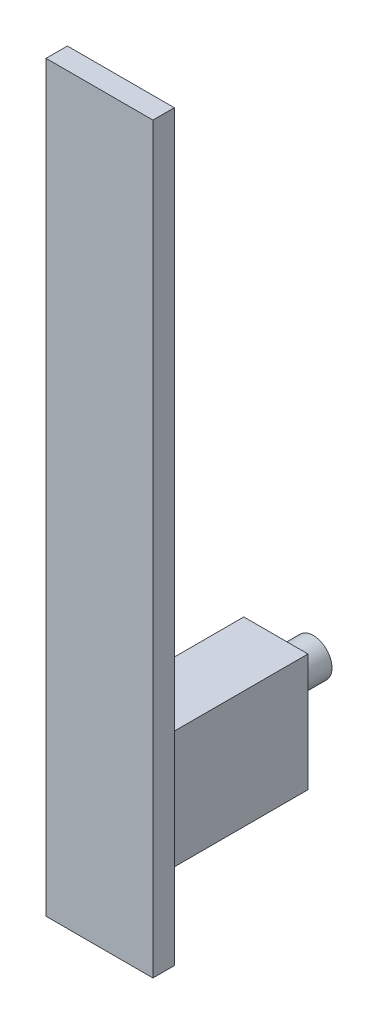
ISO-10303-21;
HEADER;
FILE_DESCRIPTION(('STEP AP214'),'2;1');
FILE_NAME('part.step','',(''),(''),'','','');
FILE_SCHEMA(('AUTOMOTIVE_DESIGN { 1 0 10303 214 1 1 1 1 }'));
ENDSEC;
DATA;
#1=APPLICATION_CONTEXT('core data for automotive mechanical design processes');
#2=APPLICATION_PROTOCOL_DEFINITION('international standard','automotive_design',2000,#1);
#3=PRODUCT_CONTEXT('',#1,'mechanical');
#4=PRODUCT('Part','Part','',(#3));
#5=PRODUCT_RELATED_PRODUCT_CATEGORY('part','',(#4));
#6=PRODUCT_DEFINITION_FORMATION('','',#4);
#7=PRODUCT_DEFINITION_CONTEXT('part definition',#1,'design');
#8=PRODUCT_DEFINITION('design','',#6,#7);
#9=PRODUCT_DEFINITION_SHAPE('','',#8);
#10=(LENGTH_UNIT() NAMED_UNIT(*) SI_UNIT(.MILLI.,.METRE.));
#11=(NAMED_UNIT(*) PLANE_ANGLE_UNIT() SI_UNIT($,.RADIAN.));
#12=(NAMED_UNIT(*) SI_UNIT($,.STERADIAN.) SOLID_ANGLE_UNIT());
#13=UNCERTAINTY_MEASURE_WITH_UNIT(LENGTH_MEASURE(1.E-05),#10,'distance_accuracy_value','');
#14=(GEOMETRIC_REPRESENTATION_CONTEXT(3) GLOBAL_UNCERTAINTY_ASSIGNED_CONTEXT((#13)) GLOBAL_UNIT_ASSIGNED_CONTEXT((#10,
#11,#12)) REPRESENTATION_CONTEXT('',''));
#15=CARTESIAN_POINT('',(0.,0.,0.));
#16=DIRECTION('',(0.,0.,1.));
#17=DIRECTION('',(1.,0.,0.));
#18=AXIS2_PLACEMENT_3D('',#15,#16,#17);
#19=CARTESIAN_POINT('',(0.,0.,4.));
#20=DIRECTION('',(1.,0.,0.));
#21=DIRECTION('',(0.,0.,-1.));
#22=AXIS2_PLACEMENT_3D('',#19,#20,#21);
#23=PLANE('',#22);
#24=DIRECTION('',(0.,-1.,0.));
#25=VECTOR('',#24,1.);
#26=CARTESIAN_POINT('',(0.,0.,0.));
#27=LINE('',#26,#25);
#28=CARTESIAN_POINT('',(0.,139.,0.));
#29=VERTEX_POINT('',#28);
#30=CARTESIAN_POINT('',(0.,0.,0.));
#31=VERTEX_POINT('',#30);
#32=EDGE_CURVE('E185',#29,#31,#27,.T.);
#33=ORIENTED_EDGE('',*,*,#32,.T.);
#34=DIRECTION('',(0.,0.,-1.));
#35=VECTOR('',#34,1.);
#36=CARTESIAN_POINT('',(0.,0.,4.));
#37=LINE('',#36,#35);
#38=CARTESIAN_POINT('',(0.,0.,4.));
#39=VERTEX_POINT('',#38);
#40=EDGE_CURVE('E40',#39,#31,#37,.T.);
#41=ORIENTED_EDGE('',*,*,#40,.F.);
#42=DIRECTION('',(0.,-1.,0.));
#43=VECTOR('',#42,1.);
#44=CARTESIAN_POINT('',(0.,0.,4.));
#45=LINE('',#44,#43);
#46=CARTESIAN_POINT('',(0.,139.,4.));
#47=VERTEX_POINT('',#46);
#48=EDGE_CURVE('E188',#47,#39,#45,.T.);
#49=ORIENTED_EDGE('',*,*,#48,.F.);
#50=DIRECTION('',(0.,0.,-1.));
#51=VECTOR('',#50,1.);
#52=CARTESIAN_POINT('',(0.,139.,4.));
#53=LINE('',#52,#51);
#54=EDGE_CURVE('E198',#47,#29,#53,.T.);
#55=ORIENTED_EDGE('',*,*,#54,.T.);
#56=EDGE_LOOP('',(#33,#41,#49,#55));
#57=FACE_BOUND('',#56,.T.);
#58=ADVANCED_FACE('F37',(#57),#23,.F.);
#59=CARTESIAN_POINT('',(0.,0.,4.));
#60=DIRECTION('',(0.,1.,0.));
#61=DIRECTION('',(0.,0.,1.));
#62=AXIS2_PLACEMENT_3D('',#59,#60,#61);
#63=PLANE('',#62);
#64=DIRECTION('',(1.,0.,0.));
#65=VECTOR('',#64,1.);
#66=CARTESIAN_POINT('',(0.,0.,0.));
#67=LINE('',#66,#65);
#68=CARTESIAN_POINT('',(2.,0.,0.));
#69=VERTEX_POINT('',#68);
#70=EDGE_CURVE('E202',#31,#69,#67,.T.);
#71=ORIENTED_EDGE('',*,*,#70,.T.);
#72=DIRECTION('',(0.,0.,1.));
#73=VECTOR('',#72,1.);
#74=CARTESIAN_POINT('',(1.99999999999999,0.,-2.));
#75=LINE('',#74,#73);
#76=CARTESIAN_POINT('',(1.99999999999999,0.,-2.));
#77=VERTEX_POINT('',#76);
#78=EDGE_CURVE('E175',#77,#69,#75,.T.);
#79=ORIENTED_EDGE('',*,*,#78,.F.);
#80=DIRECTION('',(-1.,0.,0.));
#81=VECTOR('',#80,1.);
#82=CARTESIAN_POINT('',(18.,0.,-2.));
#83=LINE('',#82,#81);
#84=CARTESIAN_POINT('',(18.,0.,-2.));
#85=VERTEX_POINT('',#84);
#86=EDGE_CURVE('E158',#85,#77,#83,.T.);
#87=ORIENTED_EDGE('',*,*,#86,.F.);
#88=DIRECTION('',(0.,0.,1.));
#89=VECTOR('',#88,1.);
#90=CARTESIAN_POINT('',(18.,0.,-2.));
#91=LINE('',#90,#89);
#92=CARTESIAN_POINT('',(18.,0.,0.));
#93=VERTEX_POINT('',#92);
#94=EDGE_CURVE('E178',#85,#93,#91,.T.);
#95=ORIENTED_EDGE('',*,*,#94,.T.);
#96=CARTESIAN_POINT('',(20.,0.,0.));
#97=VERTEX_POINT('',#96);
#98=EDGE_CURVE('E201',#93,#97,#67,.T.);
#99=ORIENTED_EDGE('',*,*,#98,.T.);
#100=DIRECTION('',(0.,0.,-1.));
#101=VECTOR('',#100,1.);
#102=CARTESIAN_POINT('',(20.,0.,4.));
#103=LINE('',#102,#101);
#104=CARTESIAN_POINT('',(20.,0.,4.));
#105=VERTEX_POINT('',#104);
#106=EDGE_CURVE('E212',#105,#97,#103,.T.);
#107=ORIENTED_EDGE('',*,*,#106,.F.);
#108=DIRECTION('',(1.,0.,0.));
#109=VECTOR('',#108,1.);
#110=CARTESIAN_POINT('',(0.,0.,4.));
#111=LINE('',#110,#109);
#112=EDGE_CURVE('E191',#39,#105,#111,.T.);
#113=ORIENTED_EDGE('',*,*,#112,.F.);
#114=ORIENTED_EDGE('',*,*,#40,.T.);
#115=EDGE_LOOP('',(#71,#79,#87,#95,#99,#107,#113,#114));
#116=FACE_BOUND('',#115,.T.);
#117=ADVANCED_FACE('F221',(#116),#63,.F.);
#118=CARTESIAN_POINT('',(20.,0.,4.));
#119=DIRECTION('',(-1.,0.,0.));
#120=DIRECTION('',(0.,0.,1.));
#121=AXIS2_PLACEMENT_3D('',#118,#119,#120);
#122=PLANE('',#121);
#123=DIRECTION('',(0.,1.,0.));
#124=VECTOR('',#123,1.);
#125=CARTESIAN_POINT('',(20.,0.,0.));
#126=LINE('',#125,#124);
#127=CARTESIAN_POINT('',(20.,139.,0.));
#128=VERTEX_POINT('',#127);
#129=EDGE_CURVE('E205',#97,#128,#126,.T.);
#130=ORIENTED_EDGE('',*,*,#129,.T.);
#131=DIRECTION('',(0.,0.,-1.));
#132=VECTOR('',#131,1.);
#133=CARTESIAN_POINT('',(20.,139.,4.));
#134=LINE('',#133,#132);
#135=CARTESIAN_POINT('',(20.,139.,4.));
#136=VERTEX_POINT('',#135);
#137=EDGE_CURVE('E210',#136,#128,#134,.T.);
#138=ORIENTED_EDGE('',*,*,#137,.F.);
#139=DIRECTION('',(0.,1.,0.));
#140=VECTOR('',#139,1.);
#141=CARTESIAN_POINT('',(20.,0.,4.));
#142=LINE('',#141,#140);
#143=EDGE_CURVE('E194',#105,#136,#142,.T.);
#144=ORIENTED_EDGE('',*,*,#143,.F.);
#145=ORIENTED_EDGE('',*,*,#106,.T.);
#146=EDGE_LOOP('',(#130,#138,#144,#145));
#147=FACE_BOUND('',#146,.T.);
#148=ADVANCED_FACE('F246',(#147),#122,.F.);
#149=CARTESIAN_POINT('',(0.,139.,4.));
#150=DIRECTION('',(0.,-1.,0.));
#151=DIRECTION('',(0.,0.,-1.));
#152=AXIS2_PLACEMENT_3D('',#149,#150,#151);
#153=PLANE('',#152);
#154=DIRECTION('',(-1.,0.,0.));
#155=VECTOR('',#154,1.);
#156=CARTESIAN_POINT('',(0.,139.,0.));
#157=LINE('',#156,#155);
#158=EDGE_CURVE('E192',#128,#29,#157,.T.);
#159=ORIENTED_EDGE('',*,*,#158,.T.);
#160=ORIENTED_EDGE('',*,*,#54,.F.);
#161=DIRECTION('',(-1.,0.,0.));
#162=VECTOR('',#161,1.);
#163=CARTESIAN_POINT('',(0.,139.,4.));
#164=LINE('',#163,#162);
#165=EDGE_CURVE('E196',#136,#47,#164,.T.);
#166=ORIENTED_EDGE('',*,*,#165,.F.);
#167=ORIENTED_EDGE('',*,*,#137,.T.);
#168=EDGE_LOOP('',(#159,#160,#166,#167));
#169=FACE_BOUND('',#168,.T.);
#170=ADVANCED_FACE('F249',(#169),#153,.F.);
#171=CARTESIAN_POINT('',(0.,0.,4.));
#172=DIRECTION('',(0.,0.,-1.));
#173=DIRECTION('',(-1.,0.,0.));
#174=AXIS2_PLACEMENT_3D('',#171,#172,#173);
#175=PLANE('',#174);
#176=ORIENTED_EDGE('',*,*,#48,.T.);
#177=ORIENTED_EDGE('',*,*,#112,.T.);
#178=ORIENTED_EDGE('',*,*,#143,.T.);
#179=ORIENTED_EDGE('',*,*,#165,.T.);
#180=EDGE_LOOP('',(#176,#177,#178,#179));
#181=FACE_BOUND('',#180,.T.);
#182=ADVANCED_FACE('F251',(#181),#175,.F.);
#183=CARTESIAN_POINT('',(0.,0.,0.));
#184=DIRECTION('',(0.,0.,-1.));
#185=DIRECTION('',(-1.,0.,0.));
#186=AXIS2_PLACEMENT_3D('',#183,#184,#185);
#187=PLANE('',#186);
#188=DIRECTION('',(0.,-1.,0.));
#189=VECTOR('',#188,1.);
#190=CARTESIAN_POINT('',(18.,45.,0.));
#191=LINE('',#190,#189);
#192=CARTESIAN_POINT('',(18.,45.,0.));
#193=VERTEX_POINT('',#192);
#194=EDGE_CURVE('E146',#193,#93,#191,.T.);
#195=ORIENTED_EDGE('',*,*,#194,.F.);
#196=DIRECTION('',(1.,0.,0.));
#197=VECTOR('',#196,1.);
#198=CARTESIAN_POINT('',(18.,45.,0.));
#199=LINE('',#198,#197);
#200=CARTESIAN_POINT('',(2.00000000000001,45.,0.));
#201=VERTEX_POINT('',#200);
#202=EDGE_CURVE('E159',#201,#193,#199,.T.);
#203=ORIENTED_EDGE('',*,*,#202,.F.);
#204=DIRECTION('',(0.,1.,0.));
#205=VECTOR('',#204,1.);
#206=CARTESIAN_POINT('',(2.00000000000001,45.,0.));
#207=LINE('',#206,#205);
#208=EDGE_CURVE('E149',#69,#201,#207,.T.);
#209=ORIENTED_EDGE('',*,*,#208,.F.);
#210=ORIENTED_EDGE('',*,*,#70,.F.);
#211=ORIENTED_EDGE('',*,*,#32,.F.);
#212=ORIENTED_EDGE('',*,*,#158,.F.);
#213=ORIENTED_EDGE('',*,*,#129,.F.);
#214=ORIENTED_EDGE('',*,*,#98,.F.);
#215=EDGE_LOOP('',(#195,#203,#209,#210,#211,#212,#213,#214));
#216=FACE_BOUND('',#215,.T.);
#217=CARTESIAN_POINT('',(10.,117.,0.));
#218=DIRECTION('',(0.,0.,-1.));
#219=DIRECTION('',(-1.,0.,0.));
#220=AXIS2_PLACEMENT_3D('',#217,#218,#219);
#221=CIRCLE('',#220,3.5);
#222=CARTESIAN_POINT('',(6.50000000000001,117.,0.));
#223=VERTEX_POINT('',#222);
#224=EDGE_CURVE('E181',#223,#223,#221,.T.);
#225=ORIENTED_EDGE('',*,*,#224,.F.);
#226=EDGE_LOOP('',(#225));
#227=FACE_BOUND('',#226,.T.);
#228=ADVANCED_FACE('F229',(#216,#227),#187,.T.);
#229=CARTESIAN_POINT('',(10.,117.,3.));
#230=DIRECTION('',(0.,0.,-1.));
#231=DIRECTION('',(-1.,0.,0.));
#232=AXIS2_PLACEMENT_3D('',#229,#230,#231);
#233=CYLINDRICAL_SURFACE('',#232,3.5);
#234=CARTESIAN_POINT('',(10.,117.,3.));
#235=DIRECTION('',(0.,0.,-1.));
#236=DIRECTION('',(-1.,0.,0.));
#237=AXIS2_PLACEMENT_3D('',#234,#235,#236);
#238=CIRCLE('',#237,3.5);
#239=CARTESIAN_POINT('',(6.50000000000001,117.,3.));
#240=VERTEX_POINT('',#239);
#241=EDGE_CURVE('E182',#240,#240,#238,.T.);
#242=ORIENTED_EDGE('',*,*,#241,.F.);
#243=EDGE_LOOP('',(#242));
#244=FACE_BOUND('',#243,.T.);
#245=ORIENTED_EDGE('',*,*,#224,.T.);
#246=EDGE_LOOP('',(#245));
#247=FACE_BOUND('',#246,.T.);
#248=ADVANCED_FACE('F258',(#244,#247),#233,.F.);
#249=CARTESIAN_POINT('',(10.,117.,3.));
#250=DIRECTION('',(0.,0.,-1.));
#251=DIRECTION('',(-1.,0.,0.));
#252=AXIS2_PLACEMENT_3D('',#249,#250,#251);
#253=PLANE('',#252);
#254=ORIENTED_EDGE('',*,*,#241,.T.);
#255=EDGE_LOOP('',(#254));
#256=FACE_BOUND('',#255,.T.);
#257=ADVANCED_FACE('F290',(#256),#253,.T.);
#258=CARTESIAN_POINT('',(18.,45.,-2.));
#259=DIRECTION('',(-1.,0.,0.));
#260=DIRECTION('',(0.,-1.,0.));
#261=AXIS2_PLACEMENT_3D('',#258,#259,#260);
#262=PLANE('',#261);
#263=ORIENTED_EDGE('',*,*,#194,.T.);
#264=ORIENTED_EDGE('',*,*,#94,.F.);
#265=DIRECTION('',(0.,-1.,0.));
#266=VECTOR('',#265,1.);
#267=CARTESIAN_POINT('',(18.,45.,-2.));
#268=LINE('',#267,#266);
#269=CARTESIAN_POINT('',(18.,45.,-2.));
#270=VERTEX_POINT('',#269);
#271=EDGE_CURVE('E155',#270,#85,#268,.T.);
#272=ORIENTED_EDGE('',*,*,#271,.F.);
#273=DIRECTION('',(0.,0.,1.));
#274=VECTOR('',#273,1.);
#275=CARTESIAN_POINT('',(18.,45.,-2.));
#276=LINE('',#275,#274);
#277=EDGE_CURVE('E164',#270,#193,#276,.T.);
#278=ORIENTED_EDGE('',*,*,#277,.T.);
#279=EDGE_LOOP('',(#263,#264,#272,#278));
#280=FACE_BOUND('',#279,.T.);
#281=ADVANCED_FACE('F244',(#280),#262,.F.);
#282=CARTESIAN_POINT('',(2.00000000000001,45.,-2.));
#283=DIRECTION('',(1.,0.,0.));
#284=DIRECTION('',(0.,1.,0.));
#285=AXIS2_PLACEMENT_3D('',#282,#283,#284);
#286=PLANE('',#285);
#287=ORIENTED_EDGE('',*,*,#208,.T.);
#288=DIRECTION('',(0.,0.,1.));
#289=VECTOR('',#288,1.);
#290=CARTESIAN_POINT('',(2.00000000000001,45.,-2.));
#291=LINE('',#290,#289);
#292=CARTESIAN_POINT('',(2.00000000000001,45.,-2.));
#293=VERTEX_POINT('',#292);
#294=EDGE_CURVE('E172',#293,#201,#291,.T.);
#295=ORIENTED_EDGE('',*,*,#294,.F.);
#296=DIRECTION('',(0.,1.,0.));
#297=VECTOR('',#296,1.);
#298=CARTESIAN_POINT('',(2.00000000000001,45.,-2.));
#299=LINE('',#298,#297);
#300=EDGE_CURVE('E161',#77,#293,#299,.T.);
#301=ORIENTED_EDGE('',*,*,#300,.F.);
#302=ORIENTED_EDGE('',*,*,#78,.T.);
#303=EDGE_LOOP('',(#287,#295,#301,#302));
#304=FACE_BOUND('',#303,.T.);
#305=ADVANCED_FACE('F233',(#304),#286,.F.);
#306=CARTESIAN_POINT('',(18.,45.,-2.));
#307=DIRECTION('',(0.,-1.,0.));
#308=DIRECTION('',(0.,0.,-1.));
#309=AXIS2_PLACEMENT_3D('',#306,#307,#308);
#310=PLANE('',#309);
#311=ORIENTED_EDGE('',*,*,#202,.T.);
#312=ORIENTED_EDGE('',*,*,#277,.F.);
#313=DIRECTION('',(1.,0.,0.));
#314=VECTOR('',#313,1.);
#315=CARTESIAN_POINT('',(18.,45.,-2.));
#316=LINE('',#315,#314);
#317=EDGE_CURVE('E163',#293,#270,#316,.T.);
#318=ORIENTED_EDGE('',*,*,#317,.F.);
#319=ORIENTED_EDGE('',*,*,#294,.T.);
#320=EDGE_LOOP('',(#311,#312,#318,#319));
#321=FACE_BOUND('',#320,.T.);
#322=ADVANCED_FACE('F237',(#321),#310,.F.);
#323=CARTESIAN_POINT('',(0.,0.,-2.));
#324=DIRECTION('',(0.,0.,-1.));
#325=DIRECTION('',(-1.,0.,0.));
#326=AXIS2_PLACEMENT_3D('',#323,#324,#325);
#327=PLANE('',#326);
#328=DIRECTION('',(0.,-1.,0.));
#329=VECTOR('',#328,1.);
#330=CARTESIAN_POINT('',(16.,34.,-2.));
#331=LINE('',#330,#329);
#332=CARTESIAN_POINT('',(16.,34.,-2.));
#333=VERTEX_POINT('',#332);
#334=CARTESIAN_POINT('',(16.,12.,-2.));
#335=VERTEX_POINT('',#334);
#336=EDGE_CURVE('E52',#333,#335,#331,.T.);
#337=ORIENTED_EDGE('',*,*,#336,.F.);
#338=DIRECTION('',(1.,0.,0.));
#339=VECTOR('',#338,1.);
#340=CARTESIAN_POINT('',(16.,34.,-2.));
#341=LINE('',#340,#339);
#342=CARTESIAN_POINT('',(4.00000000000001,34.,-2.));
#343=VERTEX_POINT('',#342);
#344=EDGE_CURVE('E56',#343,#333,#341,.T.);
#345=ORIENTED_EDGE('',*,*,#344,.F.);
#346=DIRECTION('',(0.,1.,0.));
#347=VECTOR('',#346,1.);
#348=CARTESIAN_POINT('',(4.00000000000001,34.,-2.));
#349=LINE('',#348,#347);
#350=CARTESIAN_POINT('',(4.,12.,-2.));
#351=VERTEX_POINT('',#350);
#352=EDGE_CURVE('E421',#351,#343,#349,.T.);
#353=ORIENTED_EDGE('',*,*,#352,.F.);
#354=DIRECTION('',(-1.,0.,0.));
#355=VECTOR('',#354,1.);
#356=CARTESIAN_POINT('',(16.,12.,-2.));
#357=LINE('',#356,#355);
#358=EDGE_CURVE('E414',#335,#351,#357,.T.);
#359=ORIENTED_EDGE('',*,*,#358,.F.);
#360=EDGE_LOOP('',(#337,#345,#353,#359));
#361=FACE_BOUND('',#360,.T.);
#362=ORIENTED_EDGE('',*,*,#271,.T.);
#363=ORIENTED_EDGE('',*,*,#86,.T.);
#364=ORIENTED_EDGE('',*,*,#300,.T.);
#365=ORIENTED_EDGE('',*,*,#317,.T.);
#366=EDGE_LOOP('',(#362,#363,#364,#365));
#367=FACE_BOUND('',#366,.T.);
#368=ADVANCED_FACE('F241',(#361,#367),#327,.T.);
#369=CARTESIAN_POINT('',(16.,34.,-29.));
#370=DIRECTION('',(-1.,0.,0.));
#371=DIRECTION('',(0.,-1.,0.));
#372=AXIS2_PLACEMENT_3D('',#369,#370,#371);
#373=PLANE('',#372);
#374=ORIENTED_EDGE('',*,*,#336,.T.);
#375=DIRECTION('',(0.,0.,1.));
#376=VECTOR('',#375,1.);
#377=CARTESIAN_POINT('',(16.,12.,-29.));
#378=LINE('',#377,#376);
#379=CARTESIAN_POINT('',(16.,12.,-29.));
#380=VERTEX_POINT('',#379);
#381=EDGE_CURVE('E129',#380,#335,#378,.T.);
#382=ORIENTED_EDGE('',*,*,#381,.F.);
#383=DIRECTION('',(0.,-1.,0.));
#384=VECTOR('',#383,1.);
#385=CARTESIAN_POINT('',(16.,34.,-29.));
#386=LINE('',#385,#384);
#387=CARTESIAN_POINT('',(16.,34.,-29.));
#388=VERTEX_POINT('',#387);
#389=EDGE_CURVE('E135',#388,#380,#386,.T.);
#390=ORIENTED_EDGE('',*,*,#389,.F.);
#391=DIRECTION('',(0.,0.,1.));
#392=VECTOR('',#391,1.);
#393=CARTESIAN_POINT('',(16.,34.,-29.));
#394=LINE('',#393,#392);
#395=EDGE_CURVE('E418',#388,#333,#394,.T.);
#396=ORIENTED_EDGE('',*,*,#395,.T.);
#397=EDGE_LOOP('',(#374,#382,#390,#396));
#398=FACE_BOUND('',#397,.T.);
#399=ADVANCED_FACE('F145',(#398),#373,.F.);
#400=CARTESIAN_POINT('',(16.,12.,-29.));
#401=DIRECTION('',(0.,1.,0.));
#402=DIRECTION('',(0.,0.,1.));
#403=AXIS2_PLACEMENT_3D('',#400,#401,#402);
#404=PLANE('',#403);
#405=ORIENTED_EDGE('',*,*,#358,.T.);
#406=DIRECTION('',(0.,0.,1.));
#407=VECTOR('',#406,1.);
#408=CARTESIAN_POINT('',(4.,12.,-29.));
#409=LINE('',#408,#407);
#410=CARTESIAN_POINT('',(4.,12.,-29.));
#411=VERTEX_POINT('',#410);
#412=EDGE_CURVE('E131',#411,#351,#409,.T.);
#413=ORIENTED_EDGE('',*,*,#412,.F.);
#414=DIRECTION('',(-1.,0.,0.));
#415=VECTOR('',#414,1.);
#416=CARTESIAN_POINT('',(16.,12.,-29.));
#417=LINE('',#416,#415);
#418=EDGE_CURVE('E124',#380,#411,#417,.T.);
#419=ORIENTED_EDGE('',*,*,#418,.F.);
#420=ORIENTED_EDGE('',*,*,#381,.T.);
#421=EDGE_LOOP('',(#405,#413,#419,#420));
#422=FACE_BOUND('',#421,.T.);
#423=ADVANCED_FACE('F127',(#422),#404,.F.);
#424=CARTESIAN_POINT('',(4.00000000000001,34.,-29.));
#425=DIRECTION('',(1.,0.,0.));
#426=DIRECTION('',(0.,1.,0.));
#427=AXIS2_PLACEMENT_3D('',#424,#425,#426);
#428=PLANE('',#427);
#429=ORIENTED_EDGE('',*,*,#352,.T.);
#430=DIRECTION('',(0.,0.,1.));
#431=VECTOR('',#430,1.);
#432=CARTESIAN_POINT('',(4.00000000000001,34.,-29.));
#433=LINE('',#432,#431);
#434=CARTESIAN_POINT('',(4.00000000000001,34.,-29.));
#435=VERTEX_POINT('',#434);
#436=EDGE_CURVE('E151',#435,#343,#433,.T.);
#437=ORIENTED_EDGE('',*,*,#436,.F.);
#438=DIRECTION('',(0.,1.,0.));
#439=VECTOR('',#438,1.);
#440=CARTESIAN_POINT('',(4.00000000000001,34.,-29.));
#441=LINE('',#440,#439);
#442=EDGE_CURVE('E134',#411,#435,#441,.T.);
#443=ORIENTED_EDGE('',*,*,#442,.F.);
#444=ORIENTED_EDGE('',*,*,#412,.T.);
#445=EDGE_LOOP('',(#429,#437,#443,#444));
#446=FACE_BOUND('',#445,.T.);
#447=ADVANCED_FACE('F358',(#446),#428,.F.);
#448=CARTESIAN_POINT('',(16.,34.,-29.));
#449=DIRECTION('',(0.,-1.,0.));
#450=DIRECTION('',(0.,0.,-1.));
#451=AXIS2_PLACEMENT_3D('',#448,#449,#450);
#452=PLANE('',#451);
#453=ORIENTED_EDGE('',*,*,#344,.T.);
#454=ORIENTED_EDGE('',*,*,#395,.F.);
#455=DIRECTION('',(1.,0.,0.));
#456=VECTOR('',#455,1.);
#457=CARTESIAN_POINT('',(16.,34.,-29.));
#458=LINE('',#457,#456);
#459=EDGE_CURVE('E140',#435,#388,#458,.T.);
#460=ORIENTED_EDGE('',*,*,#459,.F.);
#461=ORIENTED_EDGE('',*,*,#436,.T.);
#462=EDGE_LOOP('',(#453,#454,#460,#461));
#463=FACE_BOUND('',#462,.T.);
#464=ADVANCED_FACE('F367',(#463),#452,.F.);
#465=CARTESIAN_POINT('',(0.,0.,-29.));
#466=DIRECTION('',(0.,0.,-1.));
#467=DIRECTION('',(-1.,0.,0.));
#468=AXIS2_PLACEMENT_3D('',#465,#466,#467);
#469=PLANE('',#468);
#470=CARTESIAN_POINT('',(10.,27.,-29.));
#471=DIRECTION('',(0.,0.,-1.));
#472=DIRECTION('',(-1.,0.,0.));
#473=AXIS2_PLACEMENT_3D('',#470,#471,#472);
#474=CIRCLE('',#473,3.5);
#475=CARTESIAN_POINT('',(6.50000000000001,27.,-29.));
#476=VERTEX_POINT('',#475);
#477=EDGE_CURVE('E11',#476,#476,#474,.T.);
#478=ORIENTED_EDGE('',*,*,#477,.F.);
#479=EDGE_LOOP('',(#478));
#480=FACE_BOUND('',#479,.T.);
#481=ORIENTED_EDGE('',*,*,#389,.T.);
#482=ORIENTED_EDGE('',*,*,#418,.T.);
#483=ORIENTED_EDGE('',*,*,#442,.T.);
#484=ORIENTED_EDGE('',*,*,#459,.T.);
#485=EDGE_LOOP('',(#481,#482,#483,#484));
#486=FACE_BOUND('',#485,.T.);
#487=ADVANCED_FACE('F138',(#480,#486),#469,.T.);
#488=CARTESIAN_POINT('',(10.,27.,-36.));
#489=DIRECTION('',(0.,0.,1.));
#490=DIRECTION('',(1.,0.,0.));
#491=AXIS2_PLACEMENT_3D('',#488,#489,#490);
#492=CYLINDRICAL_SURFACE('',#491,3.5);
#493=CARTESIAN_POINT('',(10.,27.,-36.));
#494=DIRECTION('',(0.,0.,-1.));
#495=DIRECTION('',(-1.,0.,0.));
#496=AXIS2_PLACEMENT_3D('',#493,#494,#495);
#497=CIRCLE('',#496,3.5);
#498=CARTESIAN_POINT('',(6.50000000000001,27.,-36.));
#499=VERTEX_POINT('',#498);
#500=EDGE_CURVE('E412',#499,#499,#497,.T.);
#501=ORIENTED_EDGE('',*,*,#500,.F.);
#502=EDGE_LOOP('',(#501));
#503=FACE_BOUND('',#502,.T.);
#504=ORIENTED_EDGE('',*,*,#477,.T.);
#505=EDGE_LOOP('',(#504));
#506=FACE_BOUND('',#505,.T.);
#507=ADVANCED_FACE('F386',(#503,#506),#492,.T.);
#508=CARTESIAN_POINT('',(10.,27.,-36.));
#509=DIRECTION('',(0.,0.,-1.));
#510=DIRECTION('',(-1.,0.,0.));
#511=AXIS2_PLACEMENT_3D('',#508,#509,#510);
#512=PLANE('',#511);
#513=ORIENTED_EDGE('',*,*,#500,.T.);
#514=EDGE_LOOP('',(#513));
#515=FACE_BOUND('',#514,.T.);
#516=ADVANCED_FACE('F396',(#515),#512,.T.);
#517=CLOSED_SHELL('',(#58,#117,#148,#170,#182,#228,#248,#257,#281,#305,#322,#368,#399,#423,#447,
#464,#487,#507,#516));
#518=MANIFOLD_SOLID_BREP('B2',#517);
#519=ADVANCED_BREP_SHAPE_REPRESENTATION('',(#18,#518),#14);
#520=SHAPE_DEFINITION_REPRESENTATION(#9,#519);
ENDSEC;
END-ISO-10303-21;
